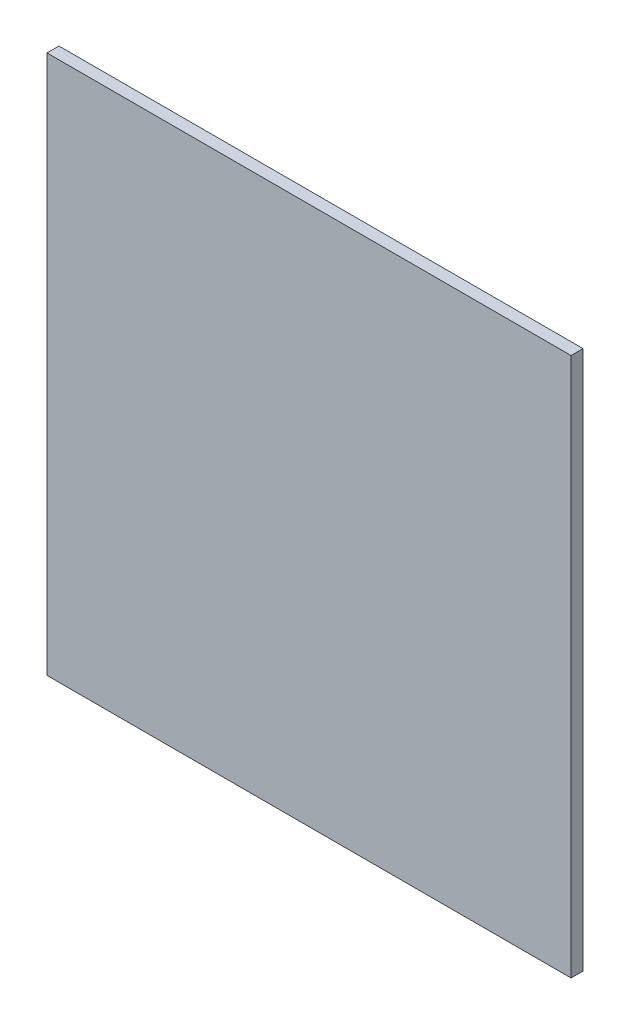
ISO-10303-21;
HEADER;
FILE_DESCRIPTION(('STEP AP214'),'2;1');
FILE_NAME('part.step','',(''),(''),'','','');
FILE_SCHEMA(('AUTOMOTIVE_DESIGN { 1 0 10303 214 1 1 1 1 }'));
ENDSEC;
DATA;
#1=APPLICATION_CONTEXT('core data for automotive mechanical design processes');
#2=APPLICATION_PROTOCOL_DEFINITION('international standard','automotive_design',2000,#1);
#3=PRODUCT_CONTEXT('',#1,'mechanical');
#4=PRODUCT('Part','Part','',(#3));
#5=PRODUCT_RELATED_PRODUCT_CATEGORY('part','',(#4));
#6=PRODUCT_DEFINITION_FORMATION('','',#4);
#7=PRODUCT_DEFINITION_CONTEXT('part definition',#1,'design');
#8=PRODUCT_DEFINITION('design','',#6,#7);
#9=PRODUCT_DEFINITION_SHAPE('','',#8);
#10=(LENGTH_UNIT() NAMED_UNIT(*) SI_UNIT(.MILLI.,.METRE.));
#11=(NAMED_UNIT(*) PLANE_ANGLE_UNIT() SI_UNIT($,.RADIAN.));
#12=(NAMED_UNIT(*) SI_UNIT($,.STERADIAN.) SOLID_ANGLE_UNIT());
#13=UNCERTAINTY_MEASURE_WITH_UNIT(LENGTH_MEASURE(1.E-05),#10,'distance_accuracy_value','');
#14=(GEOMETRIC_REPRESENTATION_CONTEXT(3) GLOBAL_UNCERTAINTY_ASSIGNED_CONTEXT((#13)) GLOBAL_UNIT_ASSIGNED_CONTEXT((#10,
#11,#12)) REPRESENTATION_CONTEXT('',''));
#15=CARTESIAN_POINT('',(0.,0.,0.));
#16=DIRECTION('',(0.,0.,1.));
#17=DIRECTION('',(1.,0.,0.));
#18=AXIS2_PLACEMENT_3D('',#15,#16,#17);
#19=CARTESIAN_POINT('',(87.5,90.,4.));
#20=DIRECTION('',(-1.,0.,0.));
#21=DIRECTION('',(0.,-1.,0.));
#22=AXIS2_PLACEMENT_3D('',#19,#20,#21);
#23=PLANE('',#22);
#24=DIRECTION('',(0.,1.,0.));
#25=VECTOR('',#24,1.);
#26=CARTESIAN_POINT('',(87.5,90.,0.));
#27=LINE('',#26,#25);
#28=CARTESIAN_POINT('',(87.5,-90.,0.));
#29=VERTEX_POINT('',#28);
#30=CARTESIAN_POINT('',(87.5,90.,0.));
#31=VERTEX_POINT('',#30);
#32=EDGE_CURVE('E99',#29,#31,#27,.T.);
#33=ORIENTED_EDGE('',*,*,#32,.T.);
#34=DIRECTION('',(0.,0.,-1.));
#35=VECTOR('',#34,1.);
#36=CARTESIAN_POINT('',(87.5,90.,4.));
#37=LINE('',#36,#35);
#38=CARTESIAN_POINT('',(87.5,90.,4.));
#39=VERTEX_POINT('',#38);
#40=EDGE_CURVE('E11',#39,#31,#37,.T.);
#41=ORIENTED_EDGE('',*,*,#40,.F.);
#42=DIRECTION('',(0.,1.,0.));
#43=VECTOR('',#42,1.);
#44=CARTESIAN_POINT('',(87.5,90.,4.));
#45=LINE('',#44,#43);
#46=CARTESIAN_POINT('',(87.5,-90.,4.));
#47=VERTEX_POINT('',#46);
#48=EDGE_CURVE('E87',#47,#39,#45,.T.);
#49=ORIENTED_EDGE('',*,*,#48,.F.);
#50=DIRECTION('',(0.,0.,-1.));
#51=VECTOR('',#50,1.);
#52=CARTESIAN_POINT('',(87.5,-90.,4.));
#53=LINE('',#52,#51);
#54=EDGE_CURVE('E95',#47,#29,#53,.T.);
#55=ORIENTED_EDGE('',*,*,#54,.T.);
#56=EDGE_LOOP('',(#33,#41,#49,#55));
#57=FACE_BOUND('',#56,.T.);
#58=ADVANCED_FACE('F36',(#57),#23,.F.);
#59=CARTESIAN_POINT('',(-87.5,90.,4.));
#60=DIRECTION('',(0.,-1.,0.));
#61=DIRECTION('',(0.,0.,-1.));
#62=AXIS2_PLACEMENT_3D('',#59,#60,#61);
#63=PLANE('',#62);
#64=DIRECTION('',(-1.,0.,0.));
#65=VECTOR('',#64,1.);
#66=CARTESIAN_POINT('',(-87.5,90.,0.));
#67=LINE('',#66,#65);
#68=CARTESIAN_POINT('',(-87.5,90.,0.));
#69=VERTEX_POINT('',#68);
#70=EDGE_CURVE('E91',#31,#69,#67,.T.);
#71=ORIENTED_EDGE('',*,*,#70,.T.);
#72=DIRECTION('',(0.,0.,-1.));
#73=VECTOR('',#72,1.);
#74=CARTESIAN_POINT('',(-87.5,90.,4.));
#75=LINE('',#74,#73);
#76=CARTESIAN_POINT('',(-87.5,90.,4.));
#77=VERTEX_POINT('',#76);
#78=EDGE_CURVE('E44',#77,#69,#75,.T.);
#79=ORIENTED_EDGE('',*,*,#78,.F.);
#80=DIRECTION('',(-1.,0.,0.));
#81=VECTOR('',#80,1.);
#82=CARTESIAN_POINT('',(-87.5,90.,4.));
#83=LINE('',#82,#81);
#84=EDGE_CURVE('E82',#39,#77,#83,.T.);
#85=ORIENTED_EDGE('',*,*,#84,.F.);
#86=ORIENTED_EDGE('',*,*,#40,.T.);
#87=EDGE_LOOP('',(#71,#79,#85,#86));
#88=FACE_BOUND('',#87,.T.);
#89=ADVANCED_FACE('F90',(#88),#63,.F.);
#90=CARTESIAN_POINT('',(-87.5,90.,4.));
#91=DIRECTION('',(1.,0.,0.));
#92=DIRECTION('',(0.,1.,0.));
#93=AXIS2_PLACEMENT_3D('',#90,#91,#92);
#94=PLANE('',#93);
#95=DIRECTION('',(0.,-1.,0.));
#96=VECTOR('',#95,1.);
#97=CARTESIAN_POINT('',(-87.5,90.,0.));
#98=LINE('',#97,#96);
#99=CARTESIAN_POINT('',(-87.4999999999999,-90.,0.));
#100=VERTEX_POINT('',#99);
#101=EDGE_CURVE('E69',#69,#100,#98,.T.);
#102=ORIENTED_EDGE('',*,*,#101,.T.);
#103=DIRECTION('',(0.,0.,-1.));
#104=VECTOR('',#103,1.);
#105=CARTESIAN_POINT('',(-87.4999999999999,-90.,4.));
#106=LINE('',#105,#104);
#107=CARTESIAN_POINT('',(-87.4999999999999,-90.,4.));
#108=VERTEX_POINT('',#107);
#109=EDGE_CURVE('E92',#108,#100,#106,.T.);
#110=ORIENTED_EDGE('',*,*,#109,.F.);
#111=DIRECTION('',(0.,-1.,0.));
#112=VECTOR('',#111,1.);
#113=CARTESIAN_POINT('',(-87.5,90.,4.));
#114=LINE('',#113,#112);
#115=EDGE_CURVE('E85',#77,#108,#114,.T.);
#116=ORIENTED_EDGE('',*,*,#115,.F.);
#117=ORIENTED_EDGE('',*,*,#78,.T.);
#118=EDGE_LOOP('',(#102,#110,#116,#117));
#119=FACE_BOUND('',#118,.T.);
#120=ADVANCED_FACE('F93',(#119),#94,.F.);
#121=CARTESIAN_POINT('',(-87.4999999999999,-90.,4.));
#122=DIRECTION('',(0.,1.,0.));
#123=DIRECTION('',(0.,0.,1.));
#124=AXIS2_PLACEMENT_3D('',#121,#122,#123);
#125=PLANE('',#124);
#126=DIRECTION('',(1.,0.,0.));
#127=VECTOR('',#126,1.);
#128=CARTESIAN_POINT('',(-87.4999999999999,-90.,0.));
#129=LINE('',#128,#127);
#130=EDGE_CURVE('E75',#100,#29,#129,.T.);
#131=ORIENTED_EDGE('',*,*,#130,.T.);
#132=ORIENTED_EDGE('',*,*,#54,.F.);
#133=DIRECTION('',(1.,0.,0.));
#134=VECTOR('',#133,1.);
#135=CARTESIAN_POINT('',(-87.4999999999999,-90.,4.));
#136=LINE('',#135,#134);
#137=EDGE_CURVE('E52',#108,#47,#136,.T.);
#138=ORIENTED_EDGE('',*,*,#137,.F.);
#139=ORIENTED_EDGE('',*,*,#109,.T.);
#140=EDGE_LOOP('',(#131,#132,#138,#139));
#141=FACE_BOUND('',#140,.T.);
#142=ADVANCED_FACE('F106',(#141),#125,.F.);
#143=CARTESIAN_POINT('',(0.,0.,4.));
#144=DIRECTION('',(0.,0.,1.));
#145=DIRECTION('',(1.,0.,0.));
#146=AXIS2_PLACEMENT_3D('',#143,#144,#145);
#147=PLANE('',#146);
#148=ORIENTED_EDGE('',*,*,#48,.T.);
#149=ORIENTED_EDGE('',*,*,#84,.T.);
#150=ORIENTED_EDGE('',*,*,#115,.T.);
#151=ORIENTED_EDGE('',*,*,#137,.T.);
#152=EDGE_LOOP('',(#148,#149,#150,#151));
#153=FACE_BOUND('',#152,.T.);
#154=ADVANCED_FACE('F83',(#153),#147,.T.);
#155=CARTESIAN_POINT('',(0.,0.,0.));
#156=DIRECTION('',(0.,0.,1.));
#157=DIRECTION('',(1.,0.,0.));
#158=AXIS2_PLACEMENT_3D('',#155,#156,#157);
#159=PLANE('',#158);
#160=ORIENTED_EDGE('',*,*,#32,.F.);
#161=ORIENTED_EDGE('',*,*,#130,.F.);
#162=ORIENTED_EDGE('',*,*,#101,.F.);
#163=ORIENTED_EDGE('',*,*,#70,.F.);
#164=EDGE_LOOP('',(#160,#161,#162,#163));
#165=FACE_BOUND('',#164,.T.);
#166=ADVANCED_FACE('F109',(#165),#159,.F.);
#167=CLOSED_SHELL('',(#58,#89,#120,#142,#154,#166));
#168=MANIFOLD_SOLID_BREP('B2',#167);
#169=ADVANCED_BREP_SHAPE_REPRESENTATION('',(#18,#168),#14);
#170=SHAPE_DEFINITION_REPRESENTATION(#9,#169);
ENDSEC;
END-ISO-10303-21;
